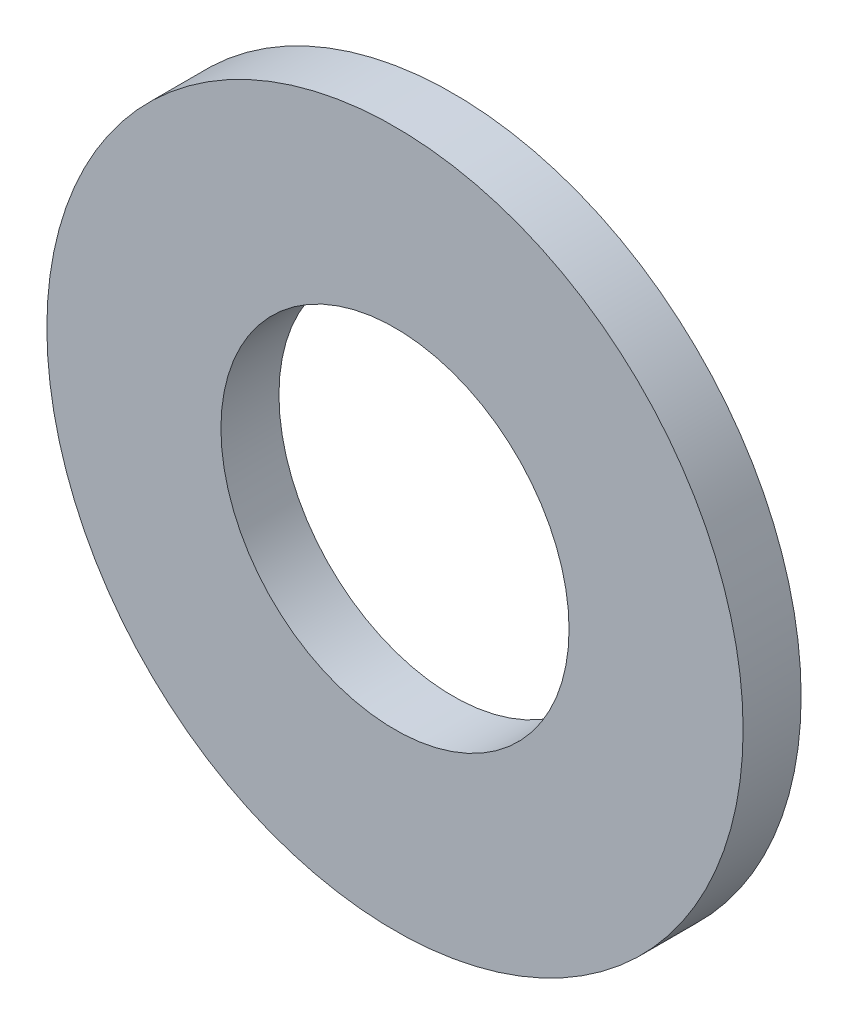
ISO-10303-21;
HEADER;
FILE_DESCRIPTION(('STEP AP214'),'2;1');
FILE_NAME('part.step','',(''),(''),'','','');
FILE_SCHEMA(('AUTOMOTIVE_DESIGN { 1 0 10303 214 1 1 1 1 }'));
ENDSEC;
DATA;
#1=APPLICATION_CONTEXT('core data for automotive mechanical design processes');
#2=APPLICATION_PROTOCOL_DEFINITION('international standard','automotive_design',2000,#1);
#3=PRODUCT_CONTEXT('',#1,'mechanical');
#4=PRODUCT('Part','Part','',(#3));
#5=PRODUCT_RELATED_PRODUCT_CATEGORY('part','',(#4));
#6=PRODUCT_DEFINITION_FORMATION('','',#4);
#7=PRODUCT_DEFINITION_CONTEXT('part definition',#1,'design');
#8=PRODUCT_DEFINITION('design','',#6,#7);
#9=PRODUCT_DEFINITION_SHAPE('','',#8);
#10=(LENGTH_UNIT() NAMED_UNIT(*) SI_UNIT(.MILLI.,.METRE.));
#11=(NAMED_UNIT(*) PLANE_ANGLE_UNIT() SI_UNIT($,.RADIAN.));
#12=(NAMED_UNIT(*) SI_UNIT($,.STERADIAN.) SOLID_ANGLE_UNIT());
#13=UNCERTAINTY_MEASURE_WITH_UNIT(LENGTH_MEASURE(1.E-05),#10,'distance_accuracy_value','');
#14=(GEOMETRIC_REPRESENTATION_CONTEXT(3) GLOBAL_UNCERTAINTY_ASSIGNED_CONTEXT((#13)) GLOBAL_UNIT_ASSIGNED_CONTEXT((#10,
#11,#12)) REPRESENTATION_CONTEXT('',''));
#15=CARTESIAN_POINT('',(0.,0.,0.));
#16=DIRECTION('',(0.,0.,1.));
#17=DIRECTION('',(1.,0.,0.));
#18=AXIS2_PLACEMENT_3D('',#15,#16,#17);
#19=CARTESIAN_POINT('',(0.,0.,0.5));
#20=DIRECTION('',(0.,0.,1.));
#21=DIRECTION('',(1.,0.,0.));
#22=AXIS2_PLACEMENT_3D('',#19,#20,#21);
#23=PLANE('',#22);
#24=CARTESIAN_POINT('',(0.,0.,0.5));
#25=DIRECTION('',(0.,0.,1.));
#26=DIRECTION('',(1.,0.,0.));
#27=AXIS2_PLACEMENT_3D('',#24,#25,#26);
#28=CIRCLE('',#27,3.);
#29=CARTESIAN_POINT('',(3.,0.,0.5));
#30=VERTEX_POINT('',#29);
#31=EDGE_CURVE('E10',#30,#30,#28,.T.);
#32=ORIENTED_EDGE('',*,*,#31,.T.);
#33=EDGE_LOOP('',(#32));
#34=FACE_BOUND('',#33,.T.);
#35=CARTESIAN_POINT('',(0.,0.,0.5));
#36=DIRECTION('',(0.,0.,1.));
#37=DIRECTION('',(1.,0.,0.));
#38=AXIS2_PLACEMENT_3D('',#35,#36,#37);
#39=CIRCLE('',#38,1.5);
#40=CARTESIAN_POINT('',(1.5,0.,0.5));
#41=VERTEX_POINT('',#40);
#42=EDGE_CURVE('E50',#41,#41,#39,.T.);
#43=ORIENTED_EDGE('',*,*,#42,.F.);
#44=EDGE_LOOP('',(#43));
#45=FACE_BOUND('',#44,.T.);
#46=ADVANCED_FACE('F37',(#34,#45),#23,.T.);
#47=CARTESIAN_POINT('',(0.,0.,0.));
#48=DIRECTION('',(0.,0.,1.));
#49=DIRECTION('',(1.,0.,0.));
#50=AXIS2_PLACEMENT_3D('',#47,#48,#49);
#51=PLANE('',#50);
#52=CARTESIAN_POINT('',(0.,0.,0.));
#53=DIRECTION('',(0.,0.,1.));
#54=DIRECTION('',(1.,0.,0.));
#55=AXIS2_PLACEMENT_3D('',#52,#53,#54);
#56=CIRCLE('',#55,3.);
#57=CARTESIAN_POINT('',(3.,0.,0.));
#58=VERTEX_POINT('',#57);
#59=EDGE_CURVE('E41',#58,#58,#56,.T.);
#60=ORIENTED_EDGE('',*,*,#59,.F.);
#61=EDGE_LOOP('',(#60));
#62=FACE_BOUND('',#61,.T.);
#63=CARTESIAN_POINT('',(0.,0.,0.));
#64=DIRECTION('',(0.,0.,1.));
#65=DIRECTION('',(1.,0.,0.));
#66=AXIS2_PLACEMENT_3D('',#63,#64,#65);
#67=CIRCLE('',#66,1.5);
#68=CARTESIAN_POINT('',(1.5,0.,0.));
#69=VERTEX_POINT('',#68);
#70=EDGE_CURVE('E52',#69,#69,#67,.T.);
#71=ORIENTED_EDGE('',*,*,#70,.T.);
#72=EDGE_LOOP('',(#71));
#73=FACE_BOUND('',#72,.T.);
#74=ADVANCED_FACE('F64',(#62,#73),#51,.F.);
#75=CARTESIAN_POINT('',(0.,0.,0.5));
#76=DIRECTION('',(0.,0.,-1.));
#77=DIRECTION('',(-1.,0.,0.));
#78=AXIS2_PLACEMENT_3D('',#75,#76,#77);
#79=CYLINDRICAL_SURFACE('',#78,3.);
#80=ORIENTED_EDGE('',*,*,#31,.F.);
#81=EDGE_LOOP('',(#80));
#82=FACE_BOUND('',#81,.T.);
#83=ORIENTED_EDGE('',*,*,#59,.T.);
#84=EDGE_LOOP('',(#83));
#85=FACE_BOUND('',#84,.T.);
#86=ADVANCED_FACE('F39',(#82,#85),#79,.T.);
#87=CARTESIAN_POINT('',(0.,0.,0.5));
#88=DIRECTION('',(0.,0.,-1.));
#89=DIRECTION('',(-1.,0.,0.));
#90=AXIS2_PLACEMENT_3D('',#87,#88,#89);
#91=CYLINDRICAL_SURFACE('',#90,1.5);
#92=ORIENTED_EDGE('',*,*,#42,.T.);
#93=EDGE_LOOP('',(#92));
#94=FACE_BOUND('',#93,.T.);
#95=ORIENTED_EDGE('',*,*,#70,.F.);
#96=EDGE_LOOP('',(#95));
#97=FACE_BOUND('',#96,.T.);
#98=ADVANCED_FACE('F60',(#94,#97),#91,.F.);
#99=CLOSED_SHELL('',(#46,#74,#86,#98));
#100=MANIFOLD_SOLID_BREP('B2',#99);
#101=ADVANCED_BREP_SHAPE_REPRESENTATION('',(#18,#100),#14);
#102=SHAPE_DEFINITION_REPRESENTATION(#9,#101);
ENDSEC;
END-ISO-10303-21;
